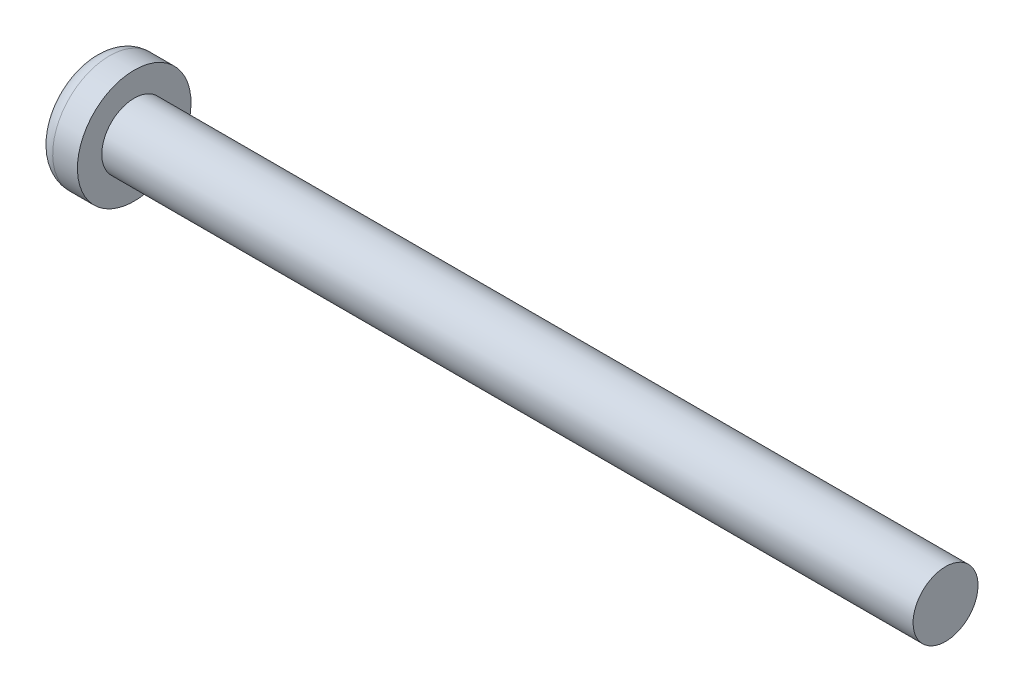
ISO-10303-21;
HEADER;
FILE_DESCRIPTION(('STEP AP214'),'2;1');
FILE_NAME('part.step','',(''),(''),'','','');
FILE_SCHEMA(('AUTOMOTIVE_DESIGN { 1 0 10303 214 1 1 1 1 }'));
ENDSEC;
DATA;
#1=APPLICATION_CONTEXT('core data for automotive mechanical design processes');
#2=APPLICATION_PROTOCOL_DEFINITION('international standard','automotive_design',2000,#1);
#3=PRODUCT_CONTEXT('',#1,'mechanical');
#4=PRODUCT('Part','Part','',(#3));
#5=PRODUCT_RELATED_PRODUCT_CATEGORY('part','',(#4));
#6=PRODUCT_DEFINITION_FORMATION('','',#4);
#7=PRODUCT_DEFINITION_CONTEXT('part definition',#1,'design');
#8=PRODUCT_DEFINITION('design','',#6,#7);
#9=PRODUCT_DEFINITION_SHAPE('','',#8);
#10=(LENGTH_UNIT() NAMED_UNIT(*) SI_UNIT(.MILLI.,.METRE.));
#11=(NAMED_UNIT(*) PLANE_ANGLE_UNIT() SI_UNIT($,.RADIAN.));
#12=(NAMED_UNIT(*) SI_UNIT($,.STERADIAN.) SOLID_ANGLE_UNIT());
#13=UNCERTAINTY_MEASURE_WITH_UNIT(LENGTH_MEASURE(1.E-05),#10,'distance_accuracy_value','');
#14=(GEOMETRIC_REPRESENTATION_CONTEXT(3) GLOBAL_UNCERTAINTY_ASSIGNED_CONTEXT((#13)) GLOBAL_UNIT_ASSIGNED_CONTEXT((#10,
#11,#12)) REPRESENTATION_CONTEXT('',''));
#15=CARTESIAN_POINT('',(0.,0.,0.));
#16=DIRECTION('',(0.,0.,1.));
#17=DIRECTION('',(1.,0.,0.));
#18=AXIS2_PLACEMENT_3D('',#15,#16,#17);
#19=CARTESIAN_POINT('',(-1.52481185989891,0.,0.));
#20=DIRECTION('',(1.,0.,0.));
#21=DIRECTION('',(0.,1.,0.));
#22=AXIS2_PLACEMENT_3D('',#19,#20,#21);
#23=TOROIDAL_SURFACE('',#22,2.5,1.);
#24=CARTESIAN_POINT('',(-2.52300445268494,0.,0.));
#25=DIRECTION('',(1.,0.,0.));
#26=DIRECTION('',(0.,1.,0.));
#27=AXIS2_PLACEMENT_3D('',#24,#25,#26);
#28=CIRCLE('',#27,2.5600961538462);
#29=CARTESIAN_POINT('',(-2.52300445268494,2.5600961538462,0.));
#30=VERTEX_POINT('',#29);
#31=EDGE_CURVE('E23',#30,#30,#28,.T.);
#32=ORIENTED_EDGE('',*,*,#31,.T.);
#33=EDGE_LOOP('',(#32));
#34=FACE_BOUND('',#33,.T.);
#35=CARTESIAN_POINT('',(-1.52481185989891,0.,0.));
#36=DIRECTION('',(1.,0.,0.));
#37=DIRECTION('',(0.,1.,0.));
#38=AXIS2_PLACEMENT_3D('',#35,#36,#37);
#39=CIRCLE('',#38,3.5);
#40=CARTESIAN_POINT('',(-1.52481185989891,3.5,0.));
#41=VERTEX_POINT('',#40);
#42=EDGE_CURVE('E208',#41,#41,#39,.T.);
#43=ORIENTED_EDGE('',*,*,#42,.F.);
#44=EDGE_LOOP('',(#43));
#45=FACE_BOUND('',#44,.T.);
#46=ADVANCED_FACE('F16',(#34,#45),#23,.T.);
#47=CARTESIAN_POINT('',(-2.52300445268494,2.5600961538462,0.));
#48=DIRECTION('',(-1.,0.,0.));
#49=DIRECTION('',(0.,-1.,0.));
#50=AXIS2_PLACEMENT_3D('',#47,#48,#49);
#51=PLANE('',#50);
#52=DIRECTION('',(0.,0.,1.));
#53=VECTOR('',#52,1.);
#54=CARTESIAN_POINT('',(-2.52300445268494,-0.466666666666667,1.16666666666667));
#55=LINE('',#54,#53);
#56=CARTESIAN_POINT('',(-2.52300445268494,-0.466666666666667,1.16666666666667));
#57=VERTEX_POINT('',#56);
#58=CARTESIAN_POINT('',(-2.52300445268494,-0.466666666666667,1.75));
#59=VERTEX_POINT('',#58);
#60=EDGE_CURVE('E30',#57,#59,#55,.T.);
#61=ORIENTED_EDGE('',*,*,#60,.F.);
#62=CARTESIAN_POINT('',(-2.52300445268494,-1.16666666666667,1.16666666666667));
#63=DIRECTION('',(1.,0.,0.));
#64=DIRECTION('',(0.,-1.,0.));
#65=AXIS2_PLACEMENT_3D('',#62,#63,#64);
#66=CIRCLE('',#65,0.7);
#67=CARTESIAN_POINT('',(-2.52300445268494,-1.16666666666667,0.466666666666667));
#68=VERTEX_POINT('',#67);
#69=EDGE_CURVE('E204',#68,#57,#66,.T.);
#70=ORIENTED_EDGE('',*,*,#69,.F.);
#71=DIRECTION('',(0.,1.,0.));
#72=VECTOR('',#71,1.);
#73=CARTESIAN_POINT('',(-2.52300445268494,-1.75,0.466666666666667));
#74=LINE('',#73,#72);
#75=CARTESIAN_POINT('',(-2.52300445268494,-1.75,0.466666666666667));
#76=VERTEX_POINT('',#75);
#77=EDGE_CURVE('E202',#76,#68,#74,.T.);
#78=ORIENTED_EDGE('',*,*,#77,.F.);
#79=DIRECTION('',(0.,0.,1.));
#80=VECTOR('',#79,1.);
#81=CARTESIAN_POINT('',(-2.52300445268494,-1.75,-0.466666666666667));
#82=LINE('',#81,#80);
#83=CARTESIAN_POINT('',(-2.52300445268494,-1.75,-0.466666666666667));
#84=VERTEX_POINT('',#83);
#85=EDGE_CURVE('E138',#84,#76,#82,.T.);
#86=ORIENTED_EDGE('',*,*,#85,.F.);
#87=DIRECTION('',(0.,-1.,0.));
#88=VECTOR('',#87,1.);
#89=CARTESIAN_POINT('',(-2.52300445268494,-1.16666666666667,-0.466666666666667));
#90=LINE('',#89,#88);
#91=CARTESIAN_POINT('',(-2.52300445268494,-1.16666666666667,-0.466666666666667));
#92=VERTEX_POINT('',#91);
#93=EDGE_CURVE('E198',#92,#84,#90,.T.);
#94=ORIENTED_EDGE('',*,*,#93,.F.);
#95=CARTESIAN_POINT('',(-2.52300445268494,-1.16666666666667,-1.16666666666667));
#96=DIRECTION('',(1.,0.,0.));
#97=DIRECTION('',(0.,-1.,0.));
#98=AXIS2_PLACEMENT_3D('',#95,#96,#97);
#99=CIRCLE('',#98,0.7);
#100=CARTESIAN_POINT('',(-2.52300445268494,-0.466666666666667,-1.16666666666667));
#101=VERTEX_POINT('',#100);
#102=EDGE_CURVE('E195',#101,#92,#99,.T.);
#103=ORIENTED_EDGE('',*,*,#102,.F.);
#104=DIRECTION('',(0.,0.,1.));
#105=VECTOR('',#104,1.);
#106=CARTESIAN_POINT('',(-2.52300445268494,-0.466666666666667,-1.75));
#107=LINE('',#106,#105);
#108=CARTESIAN_POINT('',(-2.52300445268494,-0.466666666666667,-1.75));
#109=VERTEX_POINT('',#108);
#110=EDGE_CURVE('E192',#109,#101,#107,.T.);
#111=ORIENTED_EDGE('',*,*,#110,.F.);
#112=DIRECTION('',(0.,-1.,0.));
#113=VECTOR('',#112,1.);
#114=CARTESIAN_POINT('',(-2.52300445268494,0.466666666666666,-1.75));
#115=LINE('',#114,#113);
#116=CARTESIAN_POINT('',(-2.52300445268494,0.466666666666666,-1.75));
#117=VERTEX_POINT('',#116);
#118=EDGE_CURVE('E189',#117,#109,#115,.T.);
#119=ORIENTED_EDGE('',*,*,#118,.F.);
#120=DIRECTION('',(0.,0.,-1.));
#121=VECTOR('',#120,1.);
#122=CARTESIAN_POINT('',(-2.52300445268494,0.466666666666666,-1.16666666666667));
#123=LINE('',#122,#121);
#124=CARTESIAN_POINT('',(-2.52300445268494,0.466666666666666,-1.16666666666667));
#125=VERTEX_POINT('',#124);
#126=EDGE_CURVE('E186',#125,#117,#123,.T.);
#127=ORIENTED_EDGE('',*,*,#126,.F.);
#128=CARTESIAN_POINT('',(-2.52300445268494,1.16666666666667,-1.16666666666667));
#129=DIRECTION('',(1.,0.,0.));
#130=DIRECTION('',(0.,-1.,0.));
#131=AXIS2_PLACEMENT_3D('',#128,#129,#130);
#132=CIRCLE('',#131,0.7);
#133=CARTESIAN_POINT('',(-2.52300445268494,1.16666666666667,-0.466666666666666));
#134=VERTEX_POINT('',#133);
#135=EDGE_CURVE('E183',#134,#125,#132,.T.);
#136=ORIENTED_EDGE('',*,*,#135,.F.);
#137=DIRECTION('',(0.,-1.,0.));
#138=VECTOR('',#137,1.);
#139=CARTESIAN_POINT('',(-2.52300445268494,1.75,-0.466666666666666));
#140=LINE('',#139,#138);
#141=CARTESIAN_POINT('',(-2.52300445268494,1.75,-0.466666666666666));
#142=VERTEX_POINT('',#141);
#143=EDGE_CURVE('E180',#142,#134,#140,.T.);
#144=ORIENTED_EDGE('',*,*,#143,.F.);
#145=DIRECTION('',(0.,0.,-1.));
#146=VECTOR('',#145,1.);
#147=CARTESIAN_POINT('',(-2.52300445268494,1.75,0.466666666666667));
#148=LINE('',#147,#146);
#149=CARTESIAN_POINT('',(-2.52300445268494,1.75,0.466666666666667));
#150=VERTEX_POINT('',#149);
#151=EDGE_CURVE('E177',#150,#142,#148,.T.);
#152=ORIENTED_EDGE('',*,*,#151,.F.);
#153=DIRECTION('',(0.,1.,0.));
#154=VECTOR('',#153,1.);
#155=CARTESIAN_POINT('',(-2.52300445268494,1.16666666666667,0.466666666666667));
#156=LINE('',#155,#154);
#157=CARTESIAN_POINT('',(-2.52300445268494,1.16666666666667,0.466666666666667));
#158=VERTEX_POINT('',#157);
#159=EDGE_CURVE('E174',#158,#150,#156,.T.);
#160=ORIENTED_EDGE('',*,*,#159,.F.);
#161=CARTESIAN_POINT('',(-2.52300445268494,1.16666666666667,1.16666666666667));
#162=DIRECTION('',(1.,0.,0.));
#163=DIRECTION('',(0.,-1.,0.));
#164=AXIS2_PLACEMENT_3D('',#161,#162,#163);
#165=CIRCLE('',#164,0.7);
#166=CARTESIAN_POINT('',(-2.52300445268494,0.466666666666666,1.16666666666667));
#167=VERTEX_POINT('',#166);
#168=EDGE_CURVE('E171',#167,#158,#165,.T.);
#169=ORIENTED_EDGE('',*,*,#168,.F.);
#170=DIRECTION('',(0.,0.,-1.));
#171=VECTOR('',#170,1.);
#172=CARTESIAN_POINT('',(-2.52300445268494,0.466666666666666,1.75));
#173=LINE('',#172,#171);
#174=CARTESIAN_POINT('',(-2.52300445268494,0.466666666666666,1.75));
#175=VERTEX_POINT('',#174);
#176=EDGE_CURVE('E168',#175,#167,#173,.T.);
#177=ORIENTED_EDGE('',*,*,#176,.F.);
#178=DIRECTION('',(0.,1.,0.));
#179=VECTOR('',#178,1.);
#180=CARTESIAN_POINT('',(-2.52300445268494,-0.466666666666667,1.75));
#181=LINE('',#180,#179);
#182=EDGE_CURVE('E164',#59,#175,#181,.T.);
#183=ORIENTED_EDGE('',*,*,#182,.F.);
#184=EDGE_LOOP('',(#61,#70,#78,#86,#94,#103,#111,#119,#127,#136,#144,#152,#160,#169,#177,#183));
#185=FACE_BOUND('',#184,.T.);
#186=ORIENTED_EDGE('',*,*,#31,.F.);
#187=EDGE_LOOP('',(#186));
#188=FACE_BOUND('',#187,.T.);
#189=ADVANCED_FACE('F243',(#185,#188),#51,.T.);
#190=CARTESIAN_POINT('',(0.,1.78498275000001,0.));
#191=DIRECTION('',(1.,0.,0.));
#192=DIRECTION('',(0.,1.,0.));
#193=AXIS2_PLACEMENT_3D('',#190,#191,#192);
#194=PLANE('',#193);
#195=CARTESIAN_POINT('',(0.,0.,0.));
#196=DIRECTION('',(1.,0.,0.));
#197=DIRECTION('',(0.,1.,0.));
#198=AXIS2_PLACEMENT_3D('',#195,#196,#197);
#199=CIRCLE('',#198,2.);
#200=CARTESIAN_POINT('',(0.,2.,0.));
#201=VERTEX_POINT('',#200);
#202=EDGE_CURVE('E11',#201,#201,#199,.T.);
#203=ORIENTED_EDGE('',*,*,#202,.F.);
#204=EDGE_LOOP('',(#203));
#205=FACE_BOUND('',#204,.T.);
#206=CARTESIAN_POINT('',(0.,0.,0.));
#207=DIRECTION('',(1.,0.,0.));
#208=DIRECTION('',(0.,1.,0.));
#209=AXIS2_PLACEMENT_3D('',#206,#207,#208);
#210=CIRCLE('',#209,3.5);
#211=CARTESIAN_POINT('',(0.,3.5,0.));
#212=VERTEX_POINT('',#211);
#213=EDGE_CURVE('E236',#212,#212,#210,.T.);
#214=ORIENTED_EDGE('',*,*,#213,.T.);
#215=EDGE_LOOP('',(#214));
#216=FACE_BOUND('',#215,.T.);
#217=ADVANCED_FACE('F245',(#205,#216),#194,.T.);
#218=CARTESIAN_POINT('',(40.,0.,0.));
#219=DIRECTION('',(1.,0.,0.));
#220=DIRECTION('',(0.,1.,0.));
#221=AXIS2_PLACEMENT_3D('',#218,#219,#220);
#222=CYLINDRICAL_SURFACE('',#221,3.5);
#223=ORIENTED_EDGE('',*,*,#42,.T.);
#224=EDGE_LOOP('',(#223));
#225=FACE_BOUND('',#224,.T.);
#226=ORIENTED_EDGE('',*,*,#213,.F.);
#227=EDGE_LOOP('',(#226));
#228=FACE_BOUND('',#227,.T.);
#229=ADVANCED_FACE('F253',(#225,#228),#222,.T.);
#230=CARTESIAN_POINT('',(-1.69300445268494,-0.466666666666667,1.16666666666667));
#231=DIRECTION('',(0.,-1.,0.));
#232=DIRECTION('',(1.,0.,0.));
#233=AXIS2_PLACEMENT_3D('',#230,#231,#232);
#234=PLANE('',#233);
#235=ORIENTED_EDGE('',*,*,#60,.T.);
#236=DIRECTION('',(-1.,0.,0.));
#237=VECTOR('',#236,1.);
#238=CARTESIAN_POINT('',(-1.69300445268494,-0.466666666666667,1.75));
#239=LINE('',#238,#237);
#240=CARTESIAN_POINT('',(-1.69300445268494,-0.466666666666667,1.75));
#241=VERTEX_POINT('',#240);
#242=EDGE_CURVE('E90',#241,#59,#239,.T.);
#243=ORIENTED_EDGE('',*,*,#242,.F.);
#244=DIRECTION('',(0.,0.,1.));
#245=VECTOR('',#244,1.);
#246=CARTESIAN_POINT('',(-1.69300445268494,-0.466666666666667,1.16666666666667));
#247=LINE('',#246,#245);
#248=CARTESIAN_POINT('',(-1.69300445268494,-0.466666666666667,1.16666666666667));
#249=VERTEX_POINT('',#248);
#250=EDGE_CURVE('E206',#249,#241,#247,.T.);
#251=ORIENTED_EDGE('',*,*,#250,.F.);
#252=DIRECTION('',(-1.,0.,0.));
#253=VECTOR('',#252,1.);
#254=CARTESIAN_POINT('',(-1.69300445268494,-0.466666666666667,1.16666666666667));
#255=LINE('',#254,#253);
#256=EDGE_CURVE('E38',#249,#57,#255,.T.);
#257=ORIENTED_EDGE('',*,*,#256,.T.);
#258=EDGE_LOOP('',(#235,#243,#251,#257));
#259=FACE_BOUND('',#258,.T.);
#260=ADVANCED_FACE('F259',(#259),#234,.F.);
#261=CARTESIAN_POINT('',(-1.69300445268494,-1.16666666666667,1.16666666666667));
#262=DIRECTION('',(-1.,0.,0.));
#263=DIRECTION('',(0.,-1.,0.));
#264=AXIS2_PLACEMENT_3D('',#261,#262,#263);
#265=CYLINDRICAL_SURFACE('',#264,0.7);
#266=ORIENTED_EDGE('',*,*,#69,.T.);
#267=ORIENTED_EDGE('',*,*,#256,.F.);
#268=CARTESIAN_POINT('',(-1.69300445268494,-1.16666666666667,1.16666666666667));
#269=DIRECTION('',(1.,0.,0.));
#270=DIRECTION('',(0.,-1.,0.));
#271=AXIS2_PLACEMENT_3D('',#268,#269,#270);
#272=CIRCLE('',#271,0.7);
#273=CARTESIAN_POINT('',(-1.69300445268494,-1.16666666666667,0.466666666666667));
#274=VERTEX_POINT('',#273);
#275=EDGE_CURVE('E150',#274,#249,#272,.T.);
#276=ORIENTED_EDGE('',*,*,#275,.F.);
#277=DIRECTION('',(-1.,0.,0.));
#278=VECTOR('',#277,1.);
#279=CARTESIAN_POINT('',(-1.69300445268494,-1.16666666666667,0.466666666666667));
#280=LINE('',#279,#278);
#281=EDGE_CURVE('E142',#274,#68,#280,.T.);
#282=ORIENTED_EDGE('',*,*,#281,.T.);
#283=EDGE_LOOP('',(#266,#267,#276,#282));
#284=FACE_BOUND('',#283,.T.);
#285=ADVANCED_FACE('F263',(#284),#265,.T.);
#286=CARTESIAN_POINT('',(-1.69300445268494,-1.75,0.466666666666667));
#287=DIRECTION('',(0.,0.,1.));
#288=DIRECTION('',(1.,0.,0.));
#289=AXIS2_PLACEMENT_3D('',#286,#287,#288);
#290=PLANE('',#289);
#291=ORIENTED_EDGE('',*,*,#77,.T.);
#292=ORIENTED_EDGE('',*,*,#281,.F.);
#293=DIRECTION('',(0.,1.,0.));
#294=VECTOR('',#293,1.);
#295=CARTESIAN_POINT('',(-1.69300445268494,-1.75,0.466666666666667));
#296=LINE('',#295,#294);
#297=CARTESIAN_POINT('',(-1.69300445268494,-1.75,0.466666666666667));
#298=VERTEX_POINT('',#297);
#299=EDGE_CURVE('E146',#298,#274,#296,.T.);
#300=ORIENTED_EDGE('',*,*,#299,.F.);
#301=DIRECTION('',(-1.,0.,0.));
#302=VECTOR('',#301,1.);
#303=CARTESIAN_POINT('',(-1.69300445268494,-1.75,0.466666666666667));
#304=LINE('',#303,#302);
#305=EDGE_CURVE('E131',#298,#76,#304,.T.);
#306=ORIENTED_EDGE('',*,*,#305,.T.);
#307=EDGE_LOOP('',(#291,#292,#300,#306));
#308=FACE_BOUND('',#307,.T.);
#309=ADVANCED_FACE('F147',(#308),#290,.F.);
#310=CARTESIAN_POINT('',(-1.69300445268494,-1.75,-0.466666666666667));
#311=DIRECTION('',(0.,-1.,0.));
#312=DIRECTION('',(1.,0.,0.));
#313=AXIS2_PLACEMENT_3D('',#310,#311,#312);
#314=PLANE('',#313);
#315=ORIENTED_EDGE('',*,*,#85,.T.);
#316=ORIENTED_EDGE('',*,*,#305,.F.);
#317=DIRECTION('',(0.,0.,1.));
#318=VECTOR('',#317,1.);
#319=CARTESIAN_POINT('',(-1.69300445268494,-1.75,-0.466666666666667));
#320=LINE('',#319,#318);
#321=CARTESIAN_POINT('',(-1.69300445268494,-1.75,-0.466666666666667));
#322=VERTEX_POINT('',#321);
#323=EDGE_CURVE('E135',#322,#298,#320,.T.);
#324=ORIENTED_EDGE('',*,*,#323,.F.);
#325=DIRECTION('',(-1.,0.,0.));
#326=VECTOR('',#325,1.);
#327=CARTESIAN_POINT('',(-1.69300445268494,-1.75,-0.466666666666667));
#328=LINE('',#327,#326);
#329=EDGE_CURVE('E143',#322,#84,#328,.T.);
#330=ORIENTED_EDGE('',*,*,#329,.T.);
#331=EDGE_LOOP('',(#315,#316,#324,#330));
#332=FACE_BOUND('',#331,.T.);
#333=ADVANCED_FACE('F133',(#332),#314,.F.);
#334=CARTESIAN_POINT('',(-1.69300445268494,-1.16666666666667,-0.466666666666667));
#335=DIRECTION('',(0.,0.,-1.));
#336=DIRECTION('',(0.,1.,0.));
#337=AXIS2_PLACEMENT_3D('',#334,#335,#336);
#338=PLANE('',#337);
#339=ORIENTED_EDGE('',*,*,#93,.T.);
#340=ORIENTED_EDGE('',*,*,#329,.F.);
#341=DIRECTION('',(0.,-1.,0.));
#342=VECTOR('',#341,1.);
#343=CARTESIAN_POINT('',(-1.69300445268494,-1.16666666666667,-0.466666666666667));
#344=LINE('',#343,#342);
#345=CARTESIAN_POINT('',(-1.69300445268494,-1.16666666666667,-0.466666666666667));
#346=VERTEX_POINT('',#345);
#347=EDGE_CURVE('E156',#346,#322,#344,.T.);
#348=ORIENTED_EDGE('',*,*,#347,.F.);
#349=DIRECTION('',(-1.,0.,0.));
#350=VECTOR('',#349,1.);
#351=CARTESIAN_POINT('',(-1.69300445268494,-1.16666666666667,-0.466666666666667));
#352=LINE('',#351,#350);
#353=EDGE_CURVE('E211',#346,#92,#352,.T.);
#354=ORIENTED_EDGE('',*,*,#353,.T.);
#355=EDGE_LOOP('',(#339,#340,#348,#354));
#356=FACE_BOUND('',#355,.T.);
#357=ADVANCED_FACE('F307',(#356),#338,.F.);
#358=CARTESIAN_POINT('',(-1.69300445268494,-1.16666666666667,-1.16666666666667));
#359=DIRECTION('',(-1.,0.,0.));
#360=DIRECTION('',(0.,-1.,0.));
#361=AXIS2_PLACEMENT_3D('',#358,#359,#360);
#362=CYLINDRICAL_SURFACE('',#361,0.7);
#363=ORIENTED_EDGE('',*,*,#102,.T.);
#364=ORIENTED_EDGE('',*,*,#353,.F.);
#365=CARTESIAN_POINT('',(-1.69300445268494,-1.16666666666667,-1.16666666666667));
#366=DIRECTION('',(1.,0.,0.));
#367=DIRECTION('',(0.,-1.,0.));
#368=AXIS2_PLACEMENT_3D('',#365,#366,#367);
#369=CIRCLE('',#368,0.7);
#370=CARTESIAN_POINT('',(-1.69300445268494,-0.466666666666667,-1.16666666666667));
#371=VERTEX_POINT('',#370);
#372=EDGE_CURVE('E158',#371,#346,#369,.T.);
#373=ORIENTED_EDGE('',*,*,#372,.F.);
#374=DIRECTION('',(-1.,0.,0.));
#375=VECTOR('',#374,1.);
#376=CARTESIAN_POINT('',(-1.69300445268494,-0.466666666666667,-1.16666666666667));
#377=LINE('',#376,#375);
#378=EDGE_CURVE('E213',#371,#101,#377,.T.);
#379=ORIENTED_EDGE('',*,*,#378,.T.);
#380=EDGE_LOOP('',(#363,#364,#373,#379));
#381=FACE_BOUND('',#380,.T.);
#382=ADVANCED_FACE('F303',(#381),#362,.T.);
#383=CARTESIAN_POINT('',(-1.69300445268494,-0.466666666666667,-1.75));
#384=DIRECTION('',(0.,-1.,0.));
#385=DIRECTION('',(1.,0.,0.));
#386=AXIS2_PLACEMENT_3D('',#383,#384,#385);
#387=PLANE('',#386);
#388=ORIENTED_EDGE('',*,*,#110,.T.);
#389=ORIENTED_EDGE('',*,*,#378,.F.);
#390=DIRECTION('',(0.,0.,1.));
#391=VECTOR('',#390,1.);
#392=CARTESIAN_POINT('',(-1.69300445268494,-0.466666666666667,-1.75));
#393=LINE('',#392,#391);
#394=CARTESIAN_POINT('',(-1.69300445268494,-0.466666666666667,-1.75));
#395=VERTEX_POINT('',#394);
#396=EDGE_CURVE('E364',#395,#371,#393,.T.);
#397=ORIENTED_EDGE('',*,*,#396,.F.);
#398=DIRECTION('',(-1.,0.,0.));
#399=VECTOR('',#398,1.);
#400=CARTESIAN_POINT('',(-1.69300445268494,-0.466666666666667,-1.75));
#401=LINE('',#400,#399);
#402=EDGE_CURVE('E215',#395,#109,#401,.T.);
#403=ORIENTED_EDGE('',*,*,#402,.T.);
#404=EDGE_LOOP('',(#388,#389,#397,#403));
#405=FACE_BOUND('',#404,.T.);
#406=ADVANCED_FACE('F299',(#405),#387,.F.);
#407=CARTESIAN_POINT('',(-1.69300445268494,0.466666666666667,-1.75));
#408=DIRECTION('',(0.,0.,-1.));
#409=DIRECTION('',(-1.,0.,0.));
#410=AXIS2_PLACEMENT_3D('',#407,#408,#409);
#411=PLANE('',#410);
#412=ORIENTED_EDGE('',*,*,#118,.T.);
#413=ORIENTED_EDGE('',*,*,#402,.F.);
#414=DIRECTION('',(0.,-1.,0.));
#415=VECTOR('',#414,1.);
#416=CARTESIAN_POINT('',(-1.69300445268494,0.466666666666667,-1.75));
#417=LINE('',#416,#415);
#418=CARTESIAN_POINT('',(-1.69300445268494,0.466666666666667,-1.75));
#419=VERTEX_POINT('',#418);
#420=EDGE_CURVE('E361',#419,#395,#417,.T.);
#421=ORIENTED_EDGE('',*,*,#420,.F.);
#422=DIRECTION('',(-1.,0.,0.));
#423=VECTOR('',#422,1.);
#424=CARTESIAN_POINT('',(-1.69300445268494,0.466666666666667,-1.75));
#425=LINE('',#424,#423);
#426=EDGE_CURVE('E217',#419,#117,#425,.T.);
#427=ORIENTED_EDGE('',*,*,#426,.T.);
#428=EDGE_LOOP('',(#412,#413,#421,#427));
#429=FACE_BOUND('',#428,.T.);
#430=ADVANCED_FACE('F295',(#429),#411,.F.);
#431=CARTESIAN_POINT('',(-1.69300445268494,0.466666666666667,-1.16666666666667));
#432=DIRECTION('',(0.,1.,0.));
#433=DIRECTION('',(-1.,0.,0.));
#434=AXIS2_PLACEMENT_3D('',#431,#432,#433);
#435=PLANE('',#434);
#436=ORIENTED_EDGE('',*,*,#126,.T.);
#437=ORIENTED_EDGE('',*,*,#426,.F.);
#438=DIRECTION('',(0.,0.,-1.));
#439=VECTOR('',#438,1.);
#440=CARTESIAN_POINT('',(-1.69300445268494,0.466666666666667,-1.16666666666667));
#441=LINE('',#440,#439);
#442=CARTESIAN_POINT('',(-1.69300445268494,0.466666666666667,-1.16666666666667));
#443=VERTEX_POINT('',#442);
#444=EDGE_CURVE('E358',#443,#419,#441,.T.);
#445=ORIENTED_EDGE('',*,*,#444,.F.);
#446=DIRECTION('',(-1.,0.,0.));
#447=VECTOR('',#446,1.);
#448=CARTESIAN_POINT('',(-1.69300445268494,0.466666666666667,-1.16666666666667));
#449=LINE('',#448,#447);
#450=EDGE_CURVE('E219',#443,#125,#449,.T.);
#451=ORIENTED_EDGE('',*,*,#450,.T.);
#452=EDGE_LOOP('',(#436,#437,#445,#451));
#453=FACE_BOUND('',#452,.T.);
#454=ADVANCED_FACE('F291',(#453),#435,.F.);
#455=CARTESIAN_POINT('',(-1.69300445268494,1.16666666666667,-1.16666666666667));
#456=DIRECTION('',(-1.,0.,0.));
#457=DIRECTION('',(0.,-1.,0.));
#458=AXIS2_PLACEMENT_3D('',#455,#456,#457);
#459=CYLINDRICAL_SURFACE('',#458,0.7);
#460=ORIENTED_EDGE('',*,*,#135,.T.);
#461=ORIENTED_EDGE('',*,*,#450,.F.);
#462=CARTESIAN_POINT('',(-1.69300445268494,1.16666666666667,-1.16666666666667));
#463=DIRECTION('',(1.,0.,0.));
#464=DIRECTION('',(0.,-1.,0.));
#465=AXIS2_PLACEMENT_3D('',#462,#463,#464);
#466=CIRCLE('',#465,0.7);
#467=CARTESIAN_POINT('',(-1.69300445268494,1.16666666666667,-0.466666666666666));
#468=VERTEX_POINT('',#467);
#469=EDGE_CURVE('E355',#468,#443,#466,.T.);
#470=ORIENTED_EDGE('',*,*,#469,.F.);
#471=DIRECTION('',(-1.,0.,0.));
#472=VECTOR('',#471,1.);
#473=CARTESIAN_POINT('',(-1.69300445268494,1.16666666666667,-0.466666666666666));
#474=LINE('',#473,#472);
#475=EDGE_CURVE('E221',#468,#134,#474,.T.);
#476=ORIENTED_EDGE('',*,*,#475,.T.);
#477=EDGE_LOOP('',(#460,#461,#470,#476));
#478=FACE_BOUND('',#477,.T.);
#479=ADVANCED_FACE('F287',(#478),#459,.T.);
#480=CARTESIAN_POINT('',(-1.69300445268494,1.75,-0.466666666666666));
#481=DIRECTION('',(0.,0.,-1.));
#482=DIRECTION('',(-1.,0.,0.));
#483=AXIS2_PLACEMENT_3D('',#480,#481,#482);
#484=PLANE('',#483);
#485=ORIENTED_EDGE('',*,*,#143,.T.);
#486=ORIENTED_EDGE('',*,*,#475,.F.);
#487=DIRECTION('',(0.,-1.,0.));
#488=VECTOR('',#487,1.);
#489=CARTESIAN_POINT('',(-1.69300445268494,1.75,-0.466666666666666));
#490=LINE('',#489,#488);
#491=CARTESIAN_POINT('',(-1.69300445268494,1.75,-0.466666666666666));
#492=VERTEX_POINT('',#491);
#493=EDGE_CURVE('E352',#492,#468,#490,.T.);
#494=ORIENTED_EDGE('',*,*,#493,.F.);
#495=DIRECTION('',(-1.,0.,0.));
#496=VECTOR('',#495,1.);
#497=CARTESIAN_POINT('',(-1.69300445268494,1.75,-0.466666666666666));
#498=LINE('',#497,#496);
#499=EDGE_CURVE('E223',#492,#142,#498,.T.);
#500=ORIENTED_EDGE('',*,*,#499,.T.);
#501=EDGE_LOOP('',(#485,#486,#494,#500));
#502=FACE_BOUND('',#501,.T.);
#503=ADVANCED_FACE('F283',(#502),#484,.F.);
#504=CARTESIAN_POINT('',(-1.69300445268494,1.75,0.466666666666667));
#505=DIRECTION('',(0.,1.,0.));
#506=DIRECTION('',(-1.,0.,0.));
#507=AXIS2_PLACEMENT_3D('',#504,#505,#506);
#508=PLANE('',#507);
#509=ORIENTED_EDGE('',*,*,#151,.T.);
#510=ORIENTED_EDGE('',*,*,#499,.F.);
#511=DIRECTION('',(0.,0.,-1.));
#512=VECTOR('',#511,1.);
#513=CARTESIAN_POINT('',(-1.69300445268494,1.75,0.466666666666667));
#514=LINE('',#513,#512);
#515=CARTESIAN_POINT('',(-1.69300445268494,1.75,0.466666666666667));
#516=VERTEX_POINT('',#515);
#517=EDGE_CURVE('E349',#516,#492,#514,.T.);
#518=ORIENTED_EDGE('',*,*,#517,.F.);
#519=DIRECTION('',(-1.,0.,0.));
#520=VECTOR('',#519,1.);
#521=CARTESIAN_POINT('',(-1.69300445268494,1.75,0.466666666666667));
#522=LINE('',#521,#520);
#523=EDGE_CURVE('E225',#516,#150,#522,.T.);
#524=ORIENTED_EDGE('',*,*,#523,.T.);
#525=EDGE_LOOP('',(#509,#510,#518,#524));
#526=FACE_BOUND('',#525,.T.);
#527=ADVANCED_FACE('F279',(#526),#508,.F.);
#528=CARTESIAN_POINT('',(-1.69300445268494,1.16666666666667,0.466666666666667));
#529=DIRECTION('',(0.,0.,1.));
#530=DIRECTION('',(1.,0.,0.));
#531=AXIS2_PLACEMENT_3D('',#528,#529,#530);
#532=PLANE('',#531);
#533=ORIENTED_EDGE('',*,*,#159,.T.);
#534=ORIENTED_EDGE('',*,*,#523,.F.);
#535=DIRECTION('',(0.,1.,0.));
#536=VECTOR('',#535,1.);
#537=CARTESIAN_POINT('',(-1.69300445268494,1.16666666666667,0.466666666666667));
#538=LINE('',#537,#536);
#539=CARTESIAN_POINT('',(-1.69300445268494,1.16666666666667,0.466666666666667));
#540=VERTEX_POINT('',#539);
#541=EDGE_CURVE('E346',#540,#516,#538,.T.);
#542=ORIENTED_EDGE('',*,*,#541,.F.);
#543=DIRECTION('',(-1.,0.,0.));
#544=VECTOR('',#543,1.);
#545=CARTESIAN_POINT('',(-1.69300445268494,1.16666666666667,0.466666666666667));
#546=LINE('',#545,#544);
#547=EDGE_CURVE('E227',#540,#158,#546,.T.);
#548=ORIENTED_EDGE('',*,*,#547,.T.);
#549=EDGE_LOOP('',(#533,#534,#542,#548));
#550=FACE_BOUND('',#549,.T.);
#551=ADVANCED_FACE('F275',(#550),#532,.F.);
#552=CARTESIAN_POINT('',(-1.69300445268494,1.16666666666667,1.16666666666667));
#553=DIRECTION('',(-1.,0.,0.));
#554=DIRECTION('',(0.,-1.,0.));
#555=AXIS2_PLACEMENT_3D('',#552,#553,#554);
#556=CYLINDRICAL_SURFACE('',#555,0.7);
#557=ORIENTED_EDGE('',*,*,#168,.T.);
#558=ORIENTED_EDGE('',*,*,#547,.F.);
#559=CARTESIAN_POINT('',(-1.69300445268494,1.16666666666667,1.16666666666667));
#560=DIRECTION('',(1.,0.,0.));
#561=DIRECTION('',(0.,-1.,0.));
#562=AXIS2_PLACEMENT_3D('',#559,#560,#561);
#563=CIRCLE('',#562,0.7);
#564=CARTESIAN_POINT('',(-1.69300445268494,0.466666666666667,1.16666666666667));
#565=VERTEX_POINT('',#564);
#566=EDGE_CURVE('E343',#565,#540,#563,.T.);
#567=ORIENTED_EDGE('',*,*,#566,.F.);
#568=DIRECTION('',(-1.,0.,0.));
#569=VECTOR('',#568,1.);
#570=CARTESIAN_POINT('',(-1.69300445268494,0.466666666666667,1.16666666666667));
#571=LINE('',#570,#569);
#572=EDGE_CURVE('E229',#565,#167,#571,.T.);
#573=ORIENTED_EDGE('',*,*,#572,.T.);
#574=EDGE_LOOP('',(#557,#558,#567,#573));
#575=FACE_BOUND('',#574,.T.);
#576=ADVANCED_FACE('F271',(#575),#556,.T.);
#577=CARTESIAN_POINT('',(-1.69300445268494,0.466666666666667,1.75));
#578=DIRECTION('',(0.,1.,0.));
#579=DIRECTION('',(-1.,0.,0.));
#580=AXIS2_PLACEMENT_3D('',#577,#578,#579);
#581=PLANE('',#580);
#582=ORIENTED_EDGE('',*,*,#176,.T.);
#583=ORIENTED_EDGE('',*,*,#572,.F.);
#584=DIRECTION('',(0.,0.,-1.));
#585=VECTOR('',#584,1.);
#586=CARTESIAN_POINT('',(-1.69300445268494,0.466666666666667,1.75));
#587=LINE('',#586,#585);
#588=CARTESIAN_POINT('',(-1.69300445268494,0.466666666666667,1.75));
#589=VERTEX_POINT('',#588);
#590=EDGE_CURVE('E340',#589,#565,#587,.T.);
#591=ORIENTED_EDGE('',*,*,#590,.F.);
#592=DIRECTION('',(-1.,0.,0.));
#593=VECTOR('',#592,1.);
#594=CARTESIAN_POINT('',(-1.69300445268494,0.466666666666667,1.75));
#595=LINE('',#594,#593);
#596=EDGE_CURVE('E231',#589,#175,#595,.T.);
#597=ORIENTED_EDGE('',*,*,#596,.T.);
#598=EDGE_LOOP('',(#582,#583,#591,#597));
#599=FACE_BOUND('',#598,.T.);
#600=ADVANCED_FACE('F267',(#599),#581,.F.);
#601=CARTESIAN_POINT('',(-1.69300445268494,-0.466666666666667,1.75));
#602=DIRECTION('',(0.,0.,1.));
#603=DIRECTION('',(1.,0.,0.));
#604=AXIS2_PLACEMENT_3D('',#601,#602,#603);
#605=PLANE('',#604);
#606=ORIENTED_EDGE('',*,*,#182,.T.);
#607=ORIENTED_EDGE('',*,*,#596,.F.);
#608=DIRECTION('',(0.,1.,0.));
#609=VECTOR('',#608,1.);
#610=CARTESIAN_POINT('',(-1.69300445268494,-0.466666666666667,1.75));
#611=LINE('',#610,#609);
#612=EDGE_CURVE('E337',#241,#589,#611,.T.);
#613=ORIENTED_EDGE('',*,*,#612,.F.);
#614=ORIENTED_EDGE('',*,*,#242,.T.);
#615=EDGE_LOOP('',(#606,#607,#613,#614));
#616=FACE_BOUND('',#615,.T.);
#617=ADVANCED_FACE('F264',(#616),#605,.F.);
#618=CARTESIAN_POINT('',(-1.69300445268494,1.16666666666667,1.16666666666667));
#619=DIRECTION('',(-1.,0.,0.));
#620=DIRECTION('',(0.,-1.,0.));
#621=AXIS2_PLACEMENT_3D('',#618,#619,#620);
#622=PLANE('',#621);
#623=ORIENTED_EDGE('',*,*,#250,.T.);
#624=ORIENTED_EDGE('',*,*,#612,.T.);
#625=ORIENTED_EDGE('',*,*,#590,.T.);
#626=ORIENTED_EDGE('',*,*,#566,.T.);
#627=ORIENTED_EDGE('',*,*,#541,.T.);
#628=ORIENTED_EDGE('',*,*,#517,.T.);
#629=ORIENTED_EDGE('',*,*,#493,.T.);
#630=ORIENTED_EDGE('',*,*,#469,.T.);
#631=ORIENTED_EDGE('',*,*,#444,.T.);
#632=ORIENTED_EDGE('',*,*,#420,.T.);
#633=ORIENTED_EDGE('',*,*,#396,.T.);
#634=ORIENTED_EDGE('',*,*,#372,.T.);
#635=ORIENTED_EDGE('',*,*,#347,.T.);
#636=ORIENTED_EDGE('',*,*,#323,.T.);
#637=ORIENTED_EDGE('',*,*,#299,.T.);
#638=ORIENTED_EDGE('',*,*,#275,.T.);
#639=EDGE_LOOP('',(#623,#624,#625,#626,#627,#628,#629,#630,#631,#632,#633,#634,#635,#636,#637,#638));
#640=FACE_BOUND('',#639,.T.);
#641=ADVANCED_FACE('F153',(#640),#622,.T.);
#642=CARTESIAN_POINT('',(-5.65685424949237,0.,0.));
#643=DIRECTION('',(1.,0.,0.));
#644=DIRECTION('',(0.,1.,0.));
#645=AXIS2_PLACEMENT_3D('',#642,#643,#644);
#646=CYLINDRICAL_SURFACE('',#645,2.);
#647=ORIENTED_EDGE('',*,*,#202,.T.);
#648=EDGE_LOOP('',(#647));
#649=FACE_BOUND('',#648,.T.);
#650=CARTESIAN_POINT('',(50.,0.,0.));
#651=DIRECTION('',(1.,0.,0.));
#652=DIRECTION('',(0.,1.,0.));
#653=AXIS2_PLACEMENT_3D('',#650,#651,#652);
#654=CIRCLE('',#653,2.);
#655=CARTESIAN_POINT('',(50.,2.00000000000001,0.));
#656=VERTEX_POINT('',#655);
#657=EDGE_CURVE('E165',#656,#656,#654,.T.);
#658=ORIENTED_EDGE('',*,*,#657,.F.);
#659=EDGE_LOOP('',(#658));
#660=FACE_BOUND('',#659,.T.);
#661=ADVANCED_FACE('F320',(#649,#660),#646,.T.);
#662=CARTESIAN_POINT('',(50.,0.,0.));
#663=DIRECTION('',(1.,0.,0.));
#664=DIRECTION('',(0.,1.,0.));
#665=AXIS2_PLACEMENT_3D('',#662,#663,#664);
#666=PLANE('',#665);
#667=ORIENTED_EDGE('',*,*,#657,.T.);
#668=EDGE_LOOP('',(#667));
#669=FACE_BOUND('',#668,.T.);
#670=ADVANCED_FACE('F323',(#669),#666,.T.);
#671=CLOSED_SHELL('',(#46,#189,#217,#229,#260,#285,#309,#333,#357,#382,#406,#430,#454,#479,#503,
#527,#551,#576,#600,#617,#641,#661,#670));
#672=MANIFOLD_SOLID_BREP('B1',#671);
#673=ADVANCED_BREP_SHAPE_REPRESENTATION('',(#18,#672),#14);
#674=SHAPE_DEFINITION_REPRESENTATION(#9,#673);
ENDSEC;
END-ISO-10303-21;
